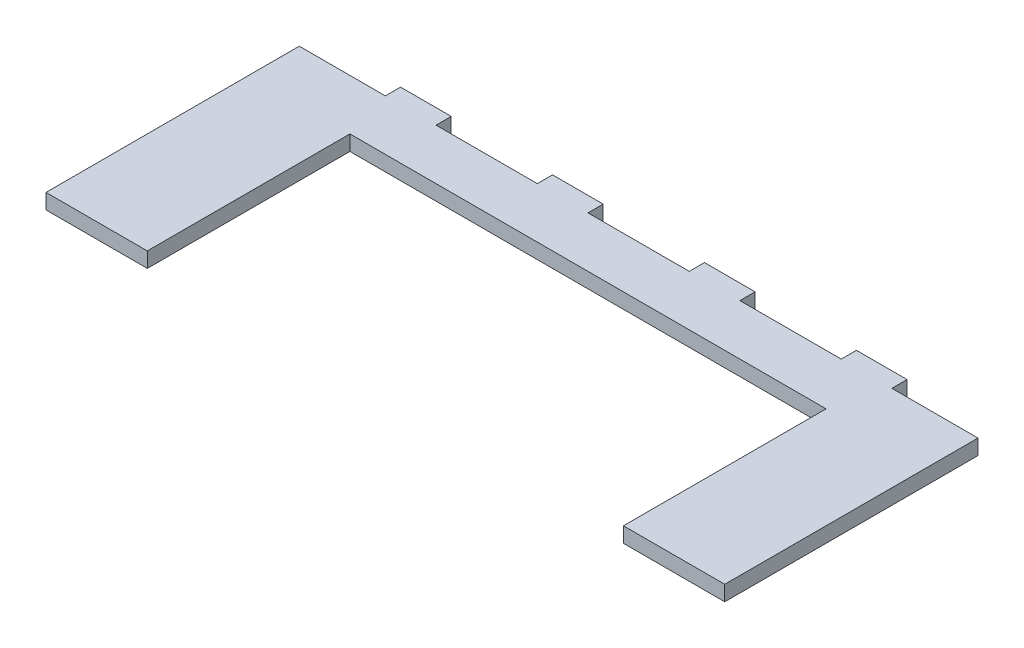
ISO-10303-21;
HEADER;
FILE_DESCRIPTION(('STEP AP214'),'2;1');
FILE_NAME('part.step','',(''),(''),'','','');
FILE_SCHEMA(('AUTOMOTIVE_DESIGN { 1 0 10303 214 1 1 1 1 }'));
ENDSEC;
DATA;
#1=APPLICATION_CONTEXT('core data for automotive mechanical design processes');
#2=APPLICATION_PROTOCOL_DEFINITION('international standard','automotive_design',2000,#1);
#3=PRODUCT_CONTEXT('',#1,'mechanical');
#4=PRODUCT('Part','Part','',(#3));
#5=PRODUCT_RELATED_PRODUCT_CATEGORY('part','',(#4));
#6=PRODUCT_DEFINITION_FORMATION('','',#4);
#7=PRODUCT_DEFINITION_CONTEXT('part definition',#1,'design');
#8=PRODUCT_DEFINITION('design','',#6,#7);
#9=PRODUCT_DEFINITION_SHAPE('','',#8);
#10=(LENGTH_UNIT() NAMED_UNIT(*) SI_UNIT(.MILLI.,.METRE.));
#11=(NAMED_UNIT(*) PLANE_ANGLE_UNIT() SI_UNIT($,.RADIAN.));
#12=(NAMED_UNIT(*) SI_UNIT($,.STERADIAN.) SOLID_ANGLE_UNIT());
#13=UNCERTAINTY_MEASURE_WITH_UNIT(LENGTH_MEASURE(1.E-05),#10,'distance_accuracy_value','');
#14=(GEOMETRIC_REPRESENTATION_CONTEXT(3) GLOBAL_UNCERTAINTY_ASSIGNED_CONTEXT((#13)) GLOBAL_UNIT_ASSIGNED_CONTEXT((#10,
#11,#12)) REPRESENTATION_CONTEXT('',''));
#15=CARTESIAN_POINT('',(0.,0.,0.));
#16=DIRECTION('',(0.,0.,1.));
#17=DIRECTION('',(1.,0.,0.));
#18=AXIS2_PLACEMENT_3D('',#15,#16,#17);
#19=CARTESIAN_POINT('',(-67.,3.,-25.));
#20=DIRECTION('',(0.,0.,1.));
#21=DIRECTION('',(1.,0.,0.));
#22=AXIS2_PLACEMENT_3D('',#19,#20,#21);
#23=PLANE('',#22);
#24=DIRECTION('',(0.,1.,0.));
#25=VECTOR('',#24,1.);
#26=CARTESIAN_POINT('',(-50.,0.,-25.));
#27=LINE('',#26,#25);
#28=CARTESIAN_POINT('',(-50.,0.,-25.));
#29=VERTEX_POINT('',#28);
#30=CARTESIAN_POINT('',(-50.,3.,-25.));
#31=VERTEX_POINT('',#30);
#32=EDGE_CURVE('E382',#29,#31,#27,.T.);
#33=ORIENTED_EDGE('',*,*,#32,.F.);
#34=DIRECTION('',(-1.,0.,0.));
#35=VECTOR('',#34,1.);
#36=CARTESIAN_POINT('',(-67.,0.,-25.));
#37=LINE('',#36,#35);
#38=CARTESIAN_POINT('',(-67.,0.,-25.));
#39=VERTEX_POINT('',#38);
#40=EDGE_CURVE('E220',#29,#39,#37,.T.);
#41=ORIENTED_EDGE('',*,*,#40,.T.);
#42=DIRECTION('',(0.,-1.,0.));
#43=VECTOR('',#42,1.);
#44=CARTESIAN_POINT('',(-67.,3.,-25.));
#45=LINE('',#44,#43);
#46=CARTESIAN_POINT('',(-67.,3.,-25.));
#47=VERTEX_POINT('',#46);
#48=EDGE_CURVE('E355',#47,#39,#45,.T.);
#49=ORIENTED_EDGE('',*,*,#48,.F.);
#50=DIRECTION('',(-1.,0.,0.));
#51=VECTOR('',#50,1.);
#52=CARTESIAN_POINT('',(-67.,3.,-25.));
#53=LINE('',#52,#51);
#54=EDGE_CURVE('E50',#31,#47,#53,.T.);
#55=ORIENTED_EDGE('',*,*,#54,.F.);
#56=EDGE_LOOP('',(#33,#41,#49,#55));
#57=FACE_BOUND('',#56,.T.);
#58=ADVANCED_FACE('F35',(#57),#23,.F.);
#59=DIRECTION('',(0.,-1.,0.));
#60=VECTOR('',#59,1.);
#61=CARTESIAN_POINT('',(-40.,0.,-25.));
#62=LINE('',#61,#60);
#63=CARTESIAN_POINT('',(-40.,3.,-25.));
#64=VERTEX_POINT('',#63);
#65=CARTESIAN_POINT('',(-40.,0.,-25.));
#66=VERTEX_POINT('',#65);
#67=EDGE_CURVE('E58',#64,#66,#62,.T.);
#68=ORIENTED_EDGE('',*,*,#67,.F.);
#69=CARTESIAN_POINT('',(-20.,3.,-25.));
#70=VERTEX_POINT('',#69);
#71=EDGE_CURVE('E408',#70,#64,#53,.T.);
#72=ORIENTED_EDGE('',*,*,#71,.F.);
#73=DIRECTION('',(0.,1.,0.));
#74=VECTOR('',#73,1.);
#75=CARTESIAN_POINT('',(-20.,0.,-25.));
#76=LINE('',#75,#74);
#77=CARTESIAN_POINT('',(-20.,0.,-25.));
#78=VERTEX_POINT('',#77);
#79=EDGE_CURVE('E221',#78,#70,#76,.T.);
#80=ORIENTED_EDGE('',*,*,#79,.F.);
#81=EDGE_CURVE('E383',#78,#66,#37,.T.);
#82=ORIENTED_EDGE('',*,*,#81,.T.);
#83=EDGE_LOOP('',(#68,#72,#80,#82));
#84=FACE_BOUND('',#83,.T.);
#85=ADVANCED_FACE('F424',(#84),#23,.F.);
#86=DIRECTION('',(0.,-1.,0.));
#87=VECTOR('',#86,1.);
#88=CARTESIAN_POINT('',(-10.,0.,-25.));
#89=LINE('',#88,#87);
#90=CARTESIAN_POINT('',(-10.,3.,-25.));
#91=VERTEX_POINT('',#90);
#92=CARTESIAN_POINT('',(-10.,0.,-25.));
#93=VERTEX_POINT('',#92);
#94=EDGE_CURVE('E224',#91,#93,#89,.T.);
#95=ORIENTED_EDGE('',*,*,#94,.F.);
#96=CARTESIAN_POINT('',(9.99999999999999,3.,-25.));
#97=VERTEX_POINT('',#96);
#98=EDGE_CURVE('E406',#97,#91,#53,.T.);
#99=ORIENTED_EDGE('',*,*,#98,.F.);
#100=DIRECTION('',(0.,1.,0.));
#101=VECTOR('',#100,1.);
#102=CARTESIAN_POINT('',(9.99999999999999,0.,-25.));
#103=LINE('',#102,#101);
#104=CARTESIAN_POINT('',(9.99999999999999,0.,-25.));
#105=VERTEX_POINT('',#104);
#106=EDGE_CURVE('E253',#105,#97,#103,.T.);
#107=ORIENTED_EDGE('',*,*,#106,.F.);
#108=EDGE_CURVE('E384',#105,#93,#37,.T.);
#109=ORIENTED_EDGE('',*,*,#108,.T.);
#110=EDGE_LOOP('',(#95,#99,#107,#109));
#111=FACE_BOUND('',#110,.T.);
#112=ADVANCED_FACE('F433',(#111),#23,.F.);
#113=DIRECTION('',(0.,-1.,0.));
#114=VECTOR('',#113,1.);
#115=CARTESIAN_POINT('',(20.,0.,-25.));
#116=LINE('',#115,#114);
#117=CARTESIAN_POINT('',(20.,3.,-25.));
#118=VERTEX_POINT('',#117);
#119=CARTESIAN_POINT('',(20.,0.,-25.));
#120=VERTEX_POINT('',#119);
#121=EDGE_CURVE('E258',#118,#120,#116,.T.);
#122=ORIENTED_EDGE('',*,*,#121,.F.);
#123=CARTESIAN_POINT('',(40.,3.,-25.));
#124=VERTEX_POINT('',#123);
#125=EDGE_CURVE('E333',#124,#118,#53,.T.);
#126=ORIENTED_EDGE('',*,*,#125,.F.);
#127=DIRECTION('',(0.,1.,0.));
#128=VECTOR('',#127,1.);
#129=CARTESIAN_POINT('',(40.,0.,-25.));
#130=LINE('',#129,#128);
#131=CARTESIAN_POINT('',(40.,0.,-25.));
#132=VERTEX_POINT('',#131);
#133=EDGE_CURVE('E285',#132,#124,#130,.T.);
#134=ORIENTED_EDGE('',*,*,#133,.F.);
#135=EDGE_CURVE('E345',#132,#120,#37,.T.);
#136=ORIENTED_EDGE('',*,*,#135,.T.);
#137=EDGE_LOOP('',(#122,#126,#134,#136));
#138=FACE_BOUND('',#137,.T.);
#139=ADVANCED_FACE('F390',(#138),#23,.F.);
#140=DIRECTION('',(0.,-1.,0.));
#141=VECTOR('',#140,1.);
#142=CARTESIAN_POINT('',(50.,0.,-25.));
#143=LINE('',#142,#141);
#144=CARTESIAN_POINT('',(50.,3.,-25.));
#145=VERTEX_POINT('',#144);
#146=CARTESIAN_POINT('',(50.,0.,-25.));
#147=VERTEX_POINT('',#146);
#148=EDGE_CURVE('E280',#145,#147,#143,.T.);
#149=ORIENTED_EDGE('',*,*,#148,.F.);
#150=CARTESIAN_POINT('',(67.,3.,-25.));
#151=VERTEX_POINT('',#150);
#152=EDGE_CURVE('E329',#151,#145,#53,.T.);
#153=ORIENTED_EDGE('',*,*,#152,.F.);
#154=DIRECTION('',(0.,-1.,0.));
#155=VECTOR('',#154,1.);
#156=CARTESIAN_POINT('',(67.,3.,-25.));
#157=LINE('',#156,#155);
#158=CARTESIAN_POINT('',(67.,0.,-25.));
#159=VERTEX_POINT('',#158);
#160=EDGE_CURVE('E358',#151,#159,#157,.T.);
#161=ORIENTED_EDGE('',*,*,#160,.T.);
#162=EDGE_CURVE('E342',#159,#147,#37,.T.);
#163=ORIENTED_EDGE('',*,*,#162,.T.);
#164=EDGE_LOOP('',(#149,#153,#161,#163));
#165=FACE_BOUND('',#164,.T.);
#166=ADVANCED_FACE('F448',(#165),#23,.F.);
#167=CARTESIAN_POINT('',(-67.,3.,25.));
#168=DIRECTION('',(0.,0.,-1.));
#169=DIRECTION('',(-1.,0.,0.));
#170=AXIS2_PLACEMENT_3D('',#167,#168,#169);
#171=PLANE('',#170);
#172=DIRECTION('',(1.,0.,0.));
#173=VECTOR('',#172,1.);
#174=CARTESIAN_POINT('',(-67.,0.,25.));
#175=LINE('',#174,#173);
#176=CARTESIAN_POINT('',(-67.,0.,25.));
#177=VERTEX_POINT('',#176);
#178=CARTESIAN_POINT('',(-47.,0.,25.));
#179=VERTEX_POINT('',#178);
#180=EDGE_CURVE('E328',#177,#179,#175,.T.);
#181=ORIENTED_EDGE('',*,*,#180,.T.);
#182=DIRECTION('',(0.,1.,0.));
#183=VECTOR('',#182,1.);
#184=CARTESIAN_POINT('',(-47.,-10.,25.));
#185=LINE('',#184,#183);
#186=CARTESIAN_POINT('',(-47.,3.,25.));
#187=VERTEX_POINT('',#186);
#188=EDGE_CURVE('E315',#179,#187,#185,.T.);
#189=ORIENTED_EDGE('',*,*,#188,.T.);
#190=DIRECTION('',(1.,0.,0.));
#191=VECTOR('',#190,1.);
#192=CARTESIAN_POINT('',(-67.,3.,25.));
#193=LINE('',#192,#191);
#194=CARTESIAN_POINT('',(-67.,3.,25.));
#195=VERTEX_POINT('',#194);
#196=EDGE_CURVE('E336',#195,#187,#193,.T.);
#197=ORIENTED_EDGE('',*,*,#196,.F.);
#198=DIRECTION('',(0.,-1.,0.));
#199=VECTOR('',#198,1.);
#200=CARTESIAN_POINT('',(-67.,3.,25.));
#201=LINE('',#200,#199);
#202=EDGE_CURVE('E352',#195,#177,#201,.T.);
#203=ORIENTED_EDGE('',*,*,#202,.T.);
#204=EDGE_LOOP('',(#181,#189,#197,#203));
#205=FACE_BOUND('',#204,.T.);
#206=ADVANCED_FACE('F375',(#205),#171,.F.);
#207=CARTESIAN_POINT('',(67.,3.,-25.));
#208=DIRECTION('',(-1.,0.,0.));
#209=DIRECTION('',(0.,0.,1.));
#210=AXIS2_PLACEMENT_3D('',#207,#208,#209);
#211=PLANE('',#210);
#212=DIRECTION('',(0.,0.,-1.));
#213=VECTOR('',#212,1.);
#214=CARTESIAN_POINT('',(67.,0.,-25.));
#215=LINE('',#214,#213);
#216=CARTESIAN_POINT('',(67.,0.,25.));
#217=VERTEX_POINT('',#216);
#218=EDGE_CURVE('E318',#217,#159,#215,.T.);
#219=ORIENTED_EDGE('',*,*,#218,.T.);
#220=ORIENTED_EDGE('',*,*,#160,.F.);
#221=DIRECTION('',(0.,0.,-1.));
#222=VECTOR('',#221,1.);
#223=CARTESIAN_POINT('',(67.,3.,-25.));
#224=LINE('',#223,#222);
#225=CARTESIAN_POINT('',(67.,3.,25.));
#226=VERTEX_POINT('',#225);
#227=EDGE_CURVE('E325',#226,#151,#224,.T.);
#228=ORIENTED_EDGE('',*,*,#227,.F.);
#229=DIRECTION('',(0.,-1.,0.));
#230=VECTOR('',#229,1.);
#231=CARTESIAN_POINT('',(67.,3.,25.));
#232=LINE('',#231,#230);
#233=EDGE_CURVE('E339',#226,#217,#232,.T.);
#234=ORIENTED_EDGE('',*,*,#233,.T.);
#235=EDGE_LOOP('',(#219,#220,#228,#234));
#236=FACE_BOUND('',#235,.T.);
#237=ADVANCED_FACE('F37',(#236),#211,.F.);
#238=CARTESIAN_POINT('',(-67.,3.,-25.));
#239=DIRECTION('',(1.,0.,0.));
#240=DIRECTION('',(0.,0.,-1.));
#241=AXIS2_PLACEMENT_3D('',#238,#239,#240);
#242=PLANE('',#241);
#243=DIRECTION('',(0.,0.,1.));
#244=VECTOR('',#243,1.);
#245=CARTESIAN_POINT('',(-67.,0.,-25.));
#246=LINE('',#245,#244);
#247=EDGE_CURVE('E344',#39,#177,#246,.T.);
#248=ORIENTED_EDGE('',*,*,#247,.T.);
#249=ORIENTED_EDGE('',*,*,#202,.F.);
#250=DIRECTION('',(0.,0.,1.));
#251=VECTOR('',#250,1.);
#252=CARTESIAN_POINT('',(-67.,3.,-25.));
#253=LINE('',#252,#251);
#254=EDGE_CURVE('E332',#47,#195,#253,.T.);
#255=ORIENTED_EDGE('',*,*,#254,.F.);
#256=ORIENTED_EDGE('',*,*,#48,.T.);
#257=EDGE_LOOP('',(#248,#249,#255,#256));
#258=FACE_BOUND('',#257,.T.);
#259=ADVANCED_FACE('F381',(#258),#242,.F.);
#260=CARTESIAN_POINT('',(47.,3.,25.));
#261=VERTEX_POINT('',#260);
#262=EDGE_CURVE('E335',#261,#226,#193,.T.);
#263=ORIENTED_EDGE('',*,*,#262,.F.);
#264=DIRECTION('',(0.,1.,0.));
#265=VECTOR('',#264,1.);
#266=CARTESIAN_POINT('',(47.,-10.,25.));
#267=LINE('',#266,#265);
#268=CARTESIAN_POINT('',(47.,0.,25.));
#269=VERTEX_POINT('',#268);
#270=EDGE_CURVE('E321',#269,#261,#267,.T.);
#271=ORIENTED_EDGE('',*,*,#270,.F.);
#272=EDGE_CURVE('E347',#269,#217,#175,.T.);
#273=ORIENTED_EDGE('',*,*,#272,.T.);
#274=ORIENTED_EDGE('',*,*,#233,.F.);
#275=EDGE_LOOP('',(#263,#271,#273,#274));
#276=FACE_BOUND('',#275,.T.);
#277=ADVANCED_FACE('F460',(#276),#171,.F.);
#278=CARTESIAN_POINT('',(0.,3.,0.));
#279=DIRECTION('',(0.,1.,0.));
#280=DIRECTION('',(0.,0.,1.));
#281=AXIS2_PLACEMENT_3D('',#278,#279,#280);
#282=PLANE('',#281);
#283=DIRECTION('',(0.,0.,1.));
#284=VECTOR('',#283,1.);
#285=CARTESIAN_POINT('',(-47.,3.,25.));
#286=LINE('',#285,#284);
#287=CARTESIAN_POINT('',(-47.,3.,-15.));
#288=VERTEX_POINT('',#287);
#289=EDGE_CURVE('E307',#288,#187,#286,.T.);
#290=ORIENTED_EDGE('',*,*,#289,.F.);
#291=DIRECTION('',(-1.,0.,0.));
#292=VECTOR('',#291,1.);
#293=CARTESIAN_POINT('',(-47.,3.,-15.));
#294=LINE('',#293,#292);
#295=CARTESIAN_POINT('',(47.,3.,-15.));
#296=VERTEX_POINT('',#295);
#297=EDGE_CURVE('E312',#296,#288,#294,.T.);
#298=ORIENTED_EDGE('',*,*,#297,.F.);
#299=DIRECTION('',(0.,0.,-1.));
#300=VECTOR('',#299,1.);
#301=CARTESIAN_POINT('',(47.,3.,25.));
#302=LINE('',#301,#300);
#303=EDGE_CURVE('E309',#261,#296,#302,.T.);
#304=ORIENTED_EDGE('',*,*,#303,.F.);
#305=ORIENTED_EDGE('',*,*,#262,.T.);
#306=ORIENTED_EDGE('',*,*,#227,.T.);
#307=ORIENTED_EDGE('',*,*,#152,.T.);
#308=DIRECTION('',(0.,0.,1.));
#309=VECTOR('',#308,1.);
#310=CARTESIAN_POINT('',(50.,3.,-28.));
#311=LINE('',#310,#309);
#312=CARTESIAN_POINT('',(50.,3.,-28.));
#313=VERTEX_POINT('',#312);
#314=EDGE_CURVE('E291',#313,#145,#311,.T.);
#315=ORIENTED_EDGE('',*,*,#314,.F.);
#316=DIRECTION('',(1.,0.,0.));
#317=VECTOR('',#316,1.);
#318=CARTESIAN_POINT('',(50.,3.,-28.));
#319=LINE('',#318,#317);
#320=CARTESIAN_POINT('',(40.,3.,-28.));
#321=VERTEX_POINT('',#320);
#322=EDGE_CURVE('E289',#321,#313,#319,.T.);
#323=ORIENTED_EDGE('',*,*,#322,.F.);
#324=DIRECTION('',(0.,0.,1.));
#325=VECTOR('',#324,1.);
#326=CARTESIAN_POINT('',(40.,3.,-28.));
#327=LINE('',#326,#325);
#328=EDGE_CURVE('E298',#321,#124,#327,.T.);
#329=ORIENTED_EDGE('',*,*,#328,.T.);
#330=ORIENTED_EDGE('',*,*,#125,.T.);
#331=DIRECTION('',(0.,0.,1.));
#332=VECTOR('',#331,1.);
#333=CARTESIAN_POINT('',(20.,3.,-28.));
#334=LINE('',#333,#332);
#335=CARTESIAN_POINT('',(20.,3.,-28.));
#336=VERTEX_POINT('',#335);
#337=EDGE_CURVE('E271',#336,#118,#334,.T.);
#338=ORIENTED_EDGE('',*,*,#337,.F.);
#339=DIRECTION('',(1.,0.,0.));
#340=VECTOR('',#339,1.);
#341=CARTESIAN_POINT('',(20.,3.,-28.));
#342=LINE('',#341,#340);
#343=CARTESIAN_POINT('',(9.99999999999999,3.,-28.));
#344=VERTEX_POINT('',#343);
#345=EDGE_CURVE('E260',#344,#336,#342,.T.);
#346=ORIENTED_EDGE('',*,*,#345,.F.);
#347=DIRECTION('',(0.,0.,1.));
#348=VECTOR('',#347,1.);
#349=CARTESIAN_POINT('',(9.99999999999999,3.,-28.));
#350=LINE('',#349,#348);
#351=EDGE_CURVE('E274',#344,#97,#350,.T.);
#352=ORIENTED_EDGE('',*,*,#351,.T.);
#353=ORIENTED_EDGE('',*,*,#98,.T.);
#354=DIRECTION('',(0.,0.,1.));
#355=VECTOR('',#354,1.);
#356=CARTESIAN_POINT('',(-10.,3.,-28.));
#357=LINE('',#356,#355);
#358=CARTESIAN_POINT('',(-10.,3.,-28.));
#359=VERTEX_POINT('',#358);
#360=EDGE_CURVE('E244',#359,#91,#357,.T.);
#361=ORIENTED_EDGE('',*,*,#360,.F.);
#362=DIRECTION('',(1.,0.,0.));
#363=VECTOR('',#362,1.);
#364=CARTESIAN_POINT('',(-10.,3.,-28.));
#365=LINE('',#364,#363);
#366=CARTESIAN_POINT('',(-20.,3.,-28.));
#367=VERTEX_POINT('',#366);
#368=EDGE_CURVE('E235',#367,#359,#365,.T.);
#369=ORIENTED_EDGE('',*,*,#368,.F.);
#370=DIRECTION('',(0.,0.,1.));
#371=VECTOR('',#370,1.);
#372=CARTESIAN_POINT('',(-20.,3.,-28.));
#373=LINE('',#372,#371);
#374=EDGE_CURVE('E247',#367,#70,#373,.T.);
#375=ORIENTED_EDGE('',*,*,#374,.T.);
#376=ORIENTED_EDGE('',*,*,#71,.T.);
#377=DIRECTION('',(0.,0.,1.));
#378=VECTOR('',#377,1.);
#379=CARTESIAN_POINT('',(-40.,3.,-28.));
#380=LINE('',#379,#378);
#381=CARTESIAN_POINT('',(-40.,3.,-28.));
#382=VERTEX_POINT('',#381);
#383=EDGE_CURVE('E226',#382,#64,#380,.T.);
#384=ORIENTED_EDGE('',*,*,#383,.F.);
#385=DIRECTION('',(1.,0.,0.));
#386=VECTOR('',#385,1.);
#387=CARTESIAN_POINT('',(-40.,3.,-28.));
#388=LINE('',#387,#386);
#389=CARTESIAN_POINT('',(-50.,3.,-28.));
#390=VERTEX_POINT('',#389);
#391=EDGE_CURVE('E206',#390,#382,#388,.T.);
#392=ORIENTED_EDGE('',*,*,#391,.F.);
#393=DIRECTION('',(0.,0.,1.));
#394=VECTOR('',#393,1.);
#395=CARTESIAN_POINT('',(-50.,3.,-28.));
#396=LINE('',#395,#394);
#397=EDGE_CURVE('E203',#390,#31,#396,.T.);
#398=ORIENTED_EDGE('',*,*,#397,.T.);
#399=ORIENTED_EDGE('',*,*,#54,.T.);
#400=ORIENTED_EDGE('',*,*,#254,.T.);
#401=ORIENTED_EDGE('',*,*,#196,.T.);
#402=EDGE_LOOP('',(#290,#298,#304,#305,#306,#307,#315,#323,#329,#330,#338,#346,#352,#353,#361,
#369,#375,#376,#384,#392,#398,#399,#400,#401));
#403=FACE_BOUND('',#402,.T.);
#404=ADVANCED_FACE('F377',(#403),#282,.T.);
#405=CARTESIAN_POINT('',(0.,0.,0.));
#406=DIRECTION('',(0.,1.,0.));
#407=DIRECTION('',(0.,0.,1.));
#408=AXIS2_PLACEMENT_3D('',#405,#406,#407);
#409=PLANE('',#408);
#410=DIRECTION('',(-1.,0.,0.));
#411=VECTOR('',#410,1.);
#412=CARTESIAN_POINT('',(0.,0.,-15.));
#413=LINE('',#412,#411);
#414=CARTESIAN_POINT('',(47.,0.,-15.));
#415=VERTEX_POINT('',#414);
#416=CARTESIAN_POINT('',(-47.,0.,-15.));
#417=VERTEX_POINT('',#416);
#418=EDGE_CURVE('E43',#415,#417,#413,.T.);
#419=ORIENTED_EDGE('',*,*,#418,.T.);
#420=DIRECTION('',(0.,0.,1.));
#421=VECTOR('',#420,1.);
#422=CARTESIAN_POINT('',(-47.,0.,0.));
#423=LINE('',#422,#421);
#424=EDGE_CURVE('E11',#417,#179,#423,.T.);
#425=ORIENTED_EDGE('',*,*,#424,.T.);
#426=ORIENTED_EDGE('',*,*,#180,.F.);
#427=ORIENTED_EDGE('',*,*,#247,.F.);
#428=ORIENTED_EDGE('',*,*,#40,.F.);
#429=DIRECTION('',(0.,0.,1.));
#430=VECTOR('',#429,1.);
#431=CARTESIAN_POINT('',(-50.,0.,-28.));
#432=LINE('',#431,#430);
#433=CARTESIAN_POINT('',(-50.,0.,-28.));
#434=VERTEX_POINT('',#433);
#435=EDGE_CURVE('E201',#434,#29,#432,.T.);
#436=ORIENTED_EDGE('',*,*,#435,.F.);
#437=DIRECTION('',(-1.,0.,0.));
#438=VECTOR('',#437,1.);
#439=CARTESIAN_POINT('',(-40.,0.,-28.));
#440=LINE('',#439,#438);
#441=CARTESIAN_POINT('',(-40.,0.,-28.));
#442=VERTEX_POINT('',#441);
#443=EDGE_CURVE('E207',#442,#434,#440,.T.);
#444=ORIENTED_EDGE('',*,*,#443,.F.);
#445=DIRECTION('',(0.,0.,1.));
#446=VECTOR('',#445,1.);
#447=CARTESIAN_POINT('',(-40.,0.,-28.));
#448=LINE('',#447,#446);
#449=EDGE_CURVE('E416',#442,#66,#448,.T.);
#450=ORIENTED_EDGE('',*,*,#449,.T.);
#451=ORIENTED_EDGE('',*,*,#81,.F.);
#452=DIRECTION('',(0.,0.,1.));
#453=VECTOR('',#452,1.);
#454=CARTESIAN_POINT('',(-20.,0.,-28.));
#455=LINE('',#454,#453);
#456=CARTESIAN_POINT('',(-20.,0.,-28.));
#457=VERTEX_POINT('',#456);
#458=EDGE_CURVE('E250',#457,#78,#455,.T.);
#459=ORIENTED_EDGE('',*,*,#458,.F.);
#460=DIRECTION('',(-1.,0.,0.));
#461=VECTOR('',#460,1.);
#462=CARTESIAN_POINT('',(-10.,0.,-28.));
#463=LINE('',#462,#461);
#464=CARTESIAN_POINT('',(-10.,0.,-28.));
#465=VERTEX_POINT('',#464);
#466=EDGE_CURVE('E230',#465,#457,#463,.T.);
#467=ORIENTED_EDGE('',*,*,#466,.F.);
#468=DIRECTION('',(0.,0.,1.));
#469=VECTOR('',#468,1.);
#470=CARTESIAN_POINT('',(-10.,0.,-28.));
#471=LINE('',#470,#469);
#472=EDGE_CURVE('E238',#465,#93,#471,.T.);
#473=ORIENTED_EDGE('',*,*,#472,.T.);
#474=ORIENTED_EDGE('',*,*,#108,.F.);
#475=DIRECTION('',(0.,0.,1.));
#476=VECTOR('',#475,1.);
#477=CARTESIAN_POINT('',(9.99999999999999,0.,-28.));
#478=LINE('',#477,#476);
#479=CARTESIAN_POINT('',(9.99999999999999,0.,-28.));
#480=VERTEX_POINT('',#479);
#481=EDGE_CURVE('E277',#480,#105,#478,.T.);
#482=ORIENTED_EDGE('',*,*,#481,.F.);
#483=DIRECTION('',(-1.,0.,0.));
#484=VECTOR('',#483,1.);
#485=CARTESIAN_POINT('',(20.,0.,-28.));
#486=LINE('',#485,#484);
#487=CARTESIAN_POINT('',(20.,0.,-28.));
#488=VERTEX_POINT('',#487);
#489=EDGE_CURVE('E254',#488,#480,#486,.T.);
#490=ORIENTED_EDGE('',*,*,#489,.F.);
#491=DIRECTION('',(0.,0.,1.));
#492=VECTOR('',#491,1.);
#493=CARTESIAN_POINT('',(20.,0.,-28.));
#494=LINE('',#493,#492);
#495=EDGE_CURVE('E264',#488,#120,#494,.T.);
#496=ORIENTED_EDGE('',*,*,#495,.T.);
#497=ORIENTED_EDGE('',*,*,#135,.F.);
#498=DIRECTION('',(0.,0.,1.));
#499=VECTOR('',#498,1.);
#500=CARTESIAN_POINT('',(40.,0.,-28.));
#501=LINE('',#500,#499);
#502=CARTESIAN_POINT('',(40.,0.,-28.));
#503=VERTEX_POINT('',#502);
#504=EDGE_CURVE('E301',#503,#132,#501,.T.);
#505=ORIENTED_EDGE('',*,*,#504,.F.);
#506=DIRECTION('',(-1.,0.,0.));
#507=VECTOR('',#506,1.);
#508=CARTESIAN_POINT('',(50.,0.,-28.));
#509=LINE('',#508,#507);
#510=CARTESIAN_POINT('',(50.,0.,-28.));
#511=VERTEX_POINT('',#510);
#512=EDGE_CURVE('E284',#511,#503,#509,.T.);
#513=ORIENTED_EDGE('',*,*,#512,.F.);
#514=DIRECTION('',(0.,0.,1.));
#515=VECTOR('',#514,1.);
#516=CARTESIAN_POINT('',(50.,0.,-28.));
#517=LINE('',#516,#515);
#518=EDGE_CURVE('E304',#511,#147,#517,.T.);
#519=ORIENTED_EDGE('',*,*,#518,.T.);
#520=ORIENTED_EDGE('',*,*,#162,.F.);
#521=ORIENTED_EDGE('',*,*,#218,.F.);
#522=ORIENTED_EDGE('',*,*,#272,.F.);
#523=DIRECTION('',(0.,0.,-1.));
#524=VECTOR('',#523,1.);
#525=CARTESIAN_POINT('',(47.,0.,0.));
#526=LINE('',#525,#524);
#527=EDGE_CURVE('E361',#269,#415,#526,.T.);
#528=ORIENTED_EDGE('',*,*,#527,.T.);
#529=EDGE_LOOP('',(#419,#425,#426,#427,#428,#436,#444,#450,#451,#459,#467,#473,#474,#482,#490,
#496,#497,#505,#513,#519,#520,#521,#522,#528));
#530=FACE_BOUND('',#529,.T.);
#531=ADVANCED_FACE('F218',(#530),#409,.F.);
#532=CARTESIAN_POINT('',(-47.,-10.,25.));
#533=DIRECTION('',(-1.,0.,0.));
#534=DIRECTION('',(0.,0.,1.));
#535=AXIS2_PLACEMENT_3D('',#532,#533,#534);
#536=PLANE('',#535);
#537=DIRECTION('',(0.,1.,0.));
#538=VECTOR('',#537,1.);
#539=CARTESIAN_POINT('',(-47.,-10.,-15.));
#540=LINE('',#539,#538);
#541=EDGE_CURVE('E316',#417,#288,#540,.T.);
#542=ORIENTED_EDGE('',*,*,#541,.T.);
#543=ORIENTED_EDGE('',*,*,#289,.T.);
#544=ORIENTED_EDGE('',*,*,#188,.F.);
#545=ORIENTED_EDGE('',*,*,#424,.F.);
#546=EDGE_LOOP('',(#542,#543,#544,#545));
#547=FACE_BOUND('',#546,.T.);
#548=ADVANCED_FACE('F372',(#547),#536,.F.);
#549=CARTESIAN_POINT('',(-47.,-10.,-15.));
#550=DIRECTION('',(0.,0.,-1.));
#551=DIRECTION('',(-1.,0.,0.));
#552=AXIS2_PLACEMENT_3D('',#549,#550,#551);
#553=PLANE('',#552);
#554=DIRECTION('',(0.,1.,0.));
#555=VECTOR('',#554,1.);
#556=CARTESIAN_POINT('',(47.,-10.,-15.));
#557=LINE('',#556,#555);
#558=EDGE_CURVE('E319',#415,#296,#557,.T.);
#559=ORIENTED_EDGE('',*,*,#558,.T.);
#560=ORIENTED_EDGE('',*,*,#297,.T.);
#561=ORIENTED_EDGE('',*,*,#541,.F.);
#562=ORIENTED_EDGE('',*,*,#418,.F.);
#563=EDGE_LOOP('',(#559,#560,#561,#562));
#564=FACE_BOUND('',#563,.T.);
#565=ADVANCED_FACE('F368',(#564),#553,.F.);
#566=CARTESIAN_POINT('',(47.,-10.,25.));
#567=DIRECTION('',(1.,0.,0.));
#568=DIRECTION('',(0.,0.,-1.));
#569=AXIS2_PLACEMENT_3D('',#566,#567,#568);
#570=PLANE('',#569);
#571=ORIENTED_EDGE('',*,*,#270,.T.);
#572=ORIENTED_EDGE('',*,*,#303,.T.);
#573=ORIENTED_EDGE('',*,*,#558,.F.);
#574=ORIENTED_EDGE('',*,*,#527,.F.);
#575=EDGE_LOOP('',(#571,#572,#573,#574));
#576=FACE_BOUND('',#575,.T.);
#577=ADVANCED_FACE('F478',(#576),#570,.F.);
#578=CARTESIAN_POINT('',(50.,0.,-28.));
#579=DIRECTION('',(-1.,0.,0.));
#580=DIRECTION('',(0.,0.,1.));
#581=AXIS2_PLACEMENT_3D('',#578,#579,#580);
#582=PLANE('',#581);
#583=ORIENTED_EDGE('',*,*,#148,.T.);
#584=ORIENTED_EDGE('',*,*,#518,.F.);
#585=DIRECTION('',(0.,-1.,0.));
#586=VECTOR('',#585,1.);
#587=CARTESIAN_POINT('',(50.,0.,-28.));
#588=LINE('',#587,#586);
#589=EDGE_CURVE('E281',#313,#511,#588,.T.);
#590=ORIENTED_EDGE('',*,*,#589,.F.);
#591=ORIENTED_EDGE('',*,*,#314,.T.);
#592=EDGE_LOOP('',(#583,#584,#590,#591));
#593=FACE_BOUND('',#592,.T.);
#594=ADVANCED_FACE('F467',(#593),#582,.F.);
#595=CARTESIAN_POINT('',(40.,0.,-28.));
#596=DIRECTION('',(1.,0.,0.));
#597=DIRECTION('',(0.,0.,-1.));
#598=AXIS2_PLACEMENT_3D('',#595,#596,#597);
#599=PLANE('',#598);
#600=ORIENTED_EDGE('',*,*,#133,.T.);
#601=ORIENTED_EDGE('',*,*,#328,.F.);
#602=DIRECTION('',(0.,1.,0.));
#603=VECTOR('',#602,1.);
#604=CARTESIAN_POINT('',(40.,0.,-28.));
#605=LINE('',#604,#603);
#606=EDGE_CURVE('E287',#503,#321,#605,.T.);
#607=ORIENTED_EDGE('',*,*,#606,.F.);
#608=ORIENTED_EDGE('',*,*,#504,.T.);
#609=EDGE_LOOP('',(#600,#601,#607,#608));
#610=FACE_BOUND('',#609,.T.);
#611=ADVANCED_FACE('F444',(#610),#599,.F.);
#612=CARTESIAN_POINT('',(0.,0.,-28.));
#613=DIRECTION('',(0.,0.,1.));
#614=DIRECTION('',(1.,0.,0.));
#615=AXIS2_PLACEMENT_3D('',#612,#613,#614);
#616=PLANE('',#615);
#617=ORIENTED_EDGE('',*,*,#589,.T.);
#618=ORIENTED_EDGE('',*,*,#512,.T.);
#619=ORIENTED_EDGE('',*,*,#606,.T.);
#620=ORIENTED_EDGE('',*,*,#322,.T.);
#621=EDGE_LOOP('',(#617,#618,#619,#620));
#622=FACE_BOUND('',#621,.T.);
#623=ADVANCED_FACE('F437',(#622),#616,.F.);
#624=CARTESIAN_POINT('',(9.99999999999999,0.,-28.));
#625=DIRECTION('',(1.,0.,0.));
#626=DIRECTION('',(0.,0.,-1.));
#627=AXIS2_PLACEMENT_3D('',#624,#625,#626);
#628=PLANE('',#627);
#629=ORIENTED_EDGE('',*,*,#106,.T.);
#630=ORIENTED_EDGE('',*,*,#351,.F.);
#631=DIRECTION('',(0.,1.,0.));
#632=VECTOR('',#631,1.);
#633=CARTESIAN_POINT('',(9.99999999999999,0.,-28.));
#634=LINE('',#633,#632);
#635=EDGE_CURVE('E257',#480,#344,#634,.T.);
#636=ORIENTED_EDGE('',*,*,#635,.F.);
#637=ORIENTED_EDGE('',*,*,#481,.T.);
#638=EDGE_LOOP('',(#629,#630,#636,#637));
#639=FACE_BOUND('',#638,.T.);
#640=ADVANCED_FACE('F435',(#639),#628,.F.);
#641=CARTESIAN_POINT('',(20.,0.,-28.));
#642=DIRECTION('',(-1.,0.,0.));
#643=DIRECTION('',(0.,0.,1.));
#644=AXIS2_PLACEMENT_3D('',#641,#642,#643);
#645=PLANE('',#644);
#646=ORIENTED_EDGE('',*,*,#121,.T.);
#647=ORIENTED_EDGE('',*,*,#495,.F.);
#648=DIRECTION('',(0.,-1.,0.));
#649=VECTOR('',#648,1.);
#650=CARTESIAN_POINT('',(20.,0.,-28.));
#651=LINE('',#650,#649);
#652=EDGE_CURVE('E262',#336,#488,#651,.T.);
#653=ORIENTED_EDGE('',*,*,#652,.F.);
#654=ORIENTED_EDGE('',*,*,#337,.T.);
#655=EDGE_LOOP('',(#646,#647,#653,#654));
#656=FACE_BOUND('',#655,.T.);
#657=ADVANCED_FACE('F395',(#656),#645,.F.);
#658=CARTESIAN_POINT('',(0.,0.,-28.));
#659=DIRECTION('',(0.,0.,-1.));
#660=DIRECTION('',(-1.,0.,0.));
#661=AXIS2_PLACEMENT_3D('',#658,#659,#660);
#662=PLANE('',#661);
#663=ORIENTED_EDGE('',*,*,#489,.T.);
#664=ORIENTED_EDGE('',*,*,#635,.T.);
#665=ORIENTED_EDGE('',*,*,#345,.T.);
#666=ORIENTED_EDGE('',*,*,#652,.T.);
#667=EDGE_LOOP('',(#663,#664,#665,#666));
#668=FACE_BOUND('',#667,.T.);
#669=ADVANCED_FACE('F401',(#668),#662,.T.);
#670=CARTESIAN_POINT('',(-20.,0.,-28.));
#671=DIRECTION('',(1.,0.,0.));
#672=DIRECTION('',(0.,0.,-1.));
#673=AXIS2_PLACEMENT_3D('',#670,#671,#672);
#674=PLANE('',#673);
#675=ORIENTED_EDGE('',*,*,#79,.T.);
#676=ORIENTED_EDGE('',*,*,#374,.F.);
#677=DIRECTION('',(0.,1.,0.));
#678=VECTOR('',#677,1.);
#679=CARTESIAN_POINT('',(-20.,0.,-28.));
#680=LINE('',#679,#678);
#681=EDGE_CURVE('E233',#457,#367,#680,.T.);
#682=ORIENTED_EDGE('',*,*,#681,.F.);
#683=ORIENTED_EDGE('',*,*,#458,.T.);
#684=EDGE_LOOP('',(#675,#676,#682,#683));
#685=FACE_BOUND('',#684,.T.);
#686=ADVANCED_FACE('F426',(#685),#674,.F.);
#687=CARTESIAN_POINT('',(-10.,0.,-28.));
#688=DIRECTION('',(-1.,0.,0.));
#689=DIRECTION('',(0.,0.,1.));
#690=AXIS2_PLACEMENT_3D('',#687,#688,#689);
#691=PLANE('',#690);
#692=ORIENTED_EDGE('',*,*,#94,.T.);
#693=ORIENTED_EDGE('',*,*,#472,.F.);
#694=DIRECTION('',(0.,-1.,0.));
#695=VECTOR('',#694,1.);
#696=CARTESIAN_POINT('',(-10.,0.,-28.));
#697=LINE('',#696,#695);
#698=EDGE_CURVE('E237',#359,#465,#697,.T.);
#699=ORIENTED_EDGE('',*,*,#698,.F.);
#700=ORIENTED_EDGE('',*,*,#360,.T.);
#701=EDGE_LOOP('',(#692,#693,#699,#700));
#702=FACE_BOUND('',#701,.T.);
#703=ADVANCED_FACE('F432',(#702),#691,.F.);
#704=CARTESIAN_POINT('',(0.,0.,-28.));
#705=DIRECTION('',(0.,0.,-1.));
#706=DIRECTION('',(-1.,0.,0.));
#707=AXIS2_PLACEMENT_3D('',#704,#705,#706);
#708=PLANE('',#707);
#709=ORIENTED_EDGE('',*,*,#466,.T.);
#710=ORIENTED_EDGE('',*,*,#681,.T.);
#711=ORIENTED_EDGE('',*,*,#368,.T.);
#712=ORIENTED_EDGE('',*,*,#698,.T.);
#713=EDGE_LOOP('',(#709,#710,#711,#712));
#714=FACE_BOUND('',#713,.T.);
#715=ADVANCED_FACE('F428',(#714),#708,.T.);
#716=CARTESIAN_POINT('',(-50.,0.,-28.));
#717=DIRECTION('',(1.,0.,0.));
#718=DIRECTION('',(0.,0.,-1.));
#719=AXIS2_PLACEMENT_3D('',#716,#717,#718);
#720=PLANE('',#719);
#721=ORIENTED_EDGE('',*,*,#32,.T.);
#722=ORIENTED_EDGE('',*,*,#397,.F.);
#723=DIRECTION('',(0.,1.,0.));
#724=VECTOR('',#723,1.);
#725=CARTESIAN_POINT('',(-50.,0.,-28.));
#726=LINE('',#725,#724);
#727=EDGE_CURVE('E197',#434,#390,#726,.T.);
#728=ORIENTED_EDGE('',*,*,#727,.F.);
#729=ORIENTED_EDGE('',*,*,#435,.T.);
#730=EDGE_LOOP('',(#721,#722,#728,#729));
#731=FACE_BOUND('',#730,.T.);
#732=ADVANCED_FACE('F199',(#731),#720,.F.);
#733=CARTESIAN_POINT('',(-40.,0.,-28.));
#734=DIRECTION('',(-1.,0.,0.));
#735=DIRECTION('',(0.,0.,1.));
#736=AXIS2_PLACEMENT_3D('',#733,#734,#735);
#737=PLANE('',#736);
#738=ORIENTED_EDGE('',*,*,#67,.T.);
#739=ORIENTED_EDGE('',*,*,#449,.F.);
#740=DIRECTION('',(0.,-1.,0.));
#741=VECTOR('',#740,1.);
#742=CARTESIAN_POINT('',(-40.,0.,-28.));
#743=LINE('',#742,#741);
#744=EDGE_CURVE('E212',#382,#442,#743,.T.);
#745=ORIENTED_EDGE('',*,*,#744,.F.);
#746=ORIENTED_EDGE('',*,*,#383,.T.);
#747=EDGE_LOOP('',(#738,#739,#745,#746));
#748=FACE_BOUND('',#747,.T.);
#749=ADVANCED_FACE('F415',(#748),#737,.F.);
#750=CARTESIAN_POINT('',(0.,0.,-28.));
#751=DIRECTION('',(0.,0.,-1.));
#752=DIRECTION('',(-1.,0.,0.));
#753=AXIS2_PLACEMENT_3D('',#750,#751,#752);
#754=PLANE('',#753);
#755=ORIENTED_EDGE('',*,*,#443,.T.);
#756=ORIENTED_EDGE('',*,*,#727,.T.);
#757=ORIENTED_EDGE('',*,*,#391,.T.);
#758=ORIENTED_EDGE('',*,*,#744,.T.);
#759=EDGE_LOOP('',(#755,#756,#757,#758));
#760=FACE_BOUND('',#759,.T.);
#761=ADVANCED_FACE('F210',(#760),#754,.T.);
#762=CLOSED_SHELL('',(#58,#85,#112,#139,#166,#206,#237,#259,#277,#404,#531,#548,#565,#577,#594,
#611,#623,#640,#657,#669,#686,#703,#715,#732,#749,#761));
#763=MANIFOLD_SOLID_BREP('B2',#762);
#764=ADVANCED_BREP_SHAPE_REPRESENTATION('',(#18,#763),#14);
#765=SHAPE_DEFINITION_REPRESENTATION(#9,#764);
ENDSEC;
END-ISO-10303-21;
